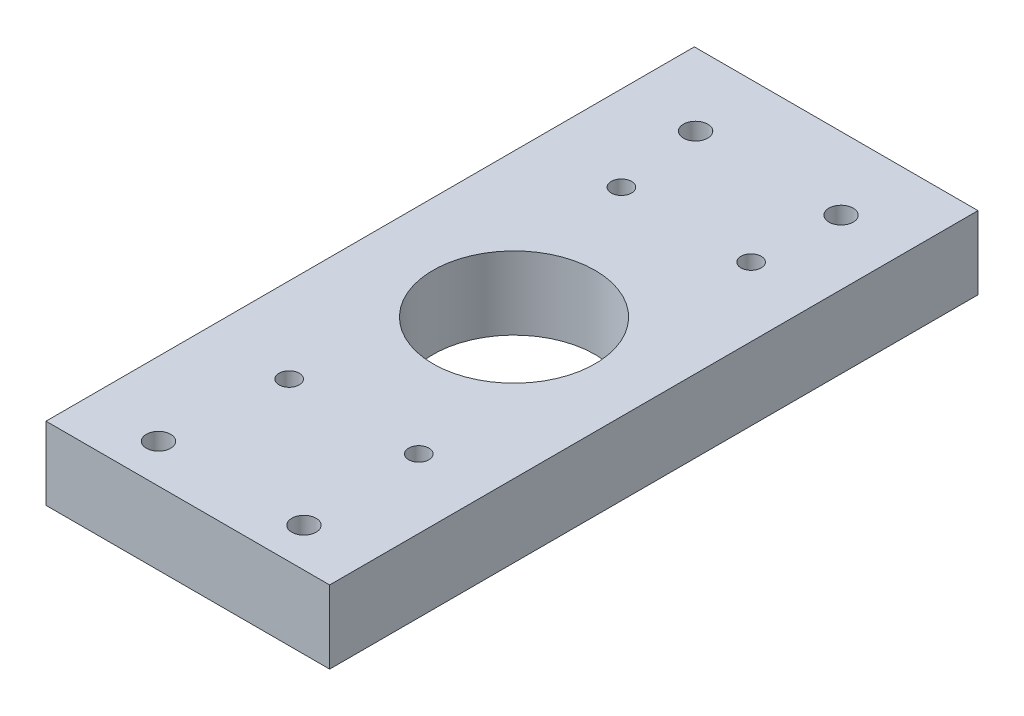
ISO-10303-21;
HEADER;
FILE_DESCRIPTION(('STEP AP214'),'2;1');
FILE_NAME('part.step','',(''),(''),'','','');
FILE_SCHEMA(('AUTOMOTIVE_DESIGN { 1 0 10303 214 1 1 1 1 }'));
ENDSEC;
DATA;
#1=APPLICATION_CONTEXT('core data for automotive mechanical design processes');
#2=APPLICATION_PROTOCOL_DEFINITION('international standard','automotive_design',2000,#1);
#3=PRODUCT_CONTEXT('',#1,'mechanical');
#4=PRODUCT('Part','Part','',(#3));
#5=PRODUCT_RELATED_PRODUCT_CATEGORY('part','',(#4));
#6=PRODUCT_DEFINITION_FORMATION('','',#4);
#7=PRODUCT_DEFINITION_CONTEXT('part definition',#1,'design');
#8=PRODUCT_DEFINITION('design','',#6,#7);
#9=PRODUCT_DEFINITION_SHAPE('','',#8);
#10=(LENGTH_UNIT() NAMED_UNIT(*) SI_UNIT(.MILLI.,.METRE.));
#11=(NAMED_UNIT(*) PLANE_ANGLE_UNIT() SI_UNIT($,.RADIAN.));
#12=(NAMED_UNIT(*) SI_UNIT($,.STERADIAN.) SOLID_ANGLE_UNIT());
#13=UNCERTAINTY_MEASURE_WITH_UNIT(LENGTH_MEASURE(1.E-05),#10,'distance_accuracy_value','');
#14=(GEOMETRIC_REPRESENTATION_CONTEXT(3) GLOBAL_UNCERTAINTY_ASSIGNED_CONTEXT((#13)) GLOBAL_UNIT_ASSIGNED_CONTEXT((#10,
#11,#12)) REPRESENTATION_CONTEXT('',''));
#15=CARTESIAN_POINT('',(0.,0.,0.));
#16=DIRECTION('',(0.,0.,1.));
#17=DIRECTION('',(1.,0.,0.));
#18=AXIS2_PLACEMENT_3D('',#15,#16,#17);
#19=CARTESIAN_POINT('',(35.,18.,-80.));
#20=DIRECTION('',(-1.,0.,0.));
#21=DIRECTION('',(0.,0.,1.));
#22=AXIS2_PLACEMENT_3D('',#19,#20,#21);
#23=PLANE('',#22);
#24=DIRECTION('',(0.,0.,-1.));
#25=VECTOR('',#24,1.);
#26=CARTESIAN_POINT('',(35.,0.,-80.));
#27=LINE('',#26,#25);
#28=CARTESIAN_POINT('',(35.,0.,80.));
#29=VERTEX_POINT('',#28);
#30=CARTESIAN_POINT('',(35.,0.,-80.));
#31=VERTEX_POINT('',#30);
#32=EDGE_CURVE('E96',#29,#31,#27,.T.);
#33=ORIENTED_EDGE('',*,*,#32,.T.);
#34=DIRECTION('',(0.,-1.,0.));
#35=VECTOR('',#34,1.);
#36=CARTESIAN_POINT('',(35.,18.,-80.));
#37=LINE('',#36,#35);
#38=CARTESIAN_POINT('',(35.,18.,-80.));
#39=VERTEX_POINT('',#38);
#40=EDGE_CURVE('E11',#39,#31,#37,.T.);
#41=ORIENTED_EDGE('',*,*,#40,.F.);
#42=DIRECTION('',(0.,0.,-1.));
#43=VECTOR('',#42,1.);
#44=CARTESIAN_POINT('',(35.,18.,-80.));
#45=LINE('',#44,#43);
#46=CARTESIAN_POINT('',(35.,18.,80.));
#47=VERTEX_POINT('',#46);
#48=EDGE_CURVE('E84',#47,#39,#45,.T.);
#49=ORIENTED_EDGE('',*,*,#48,.F.);
#50=DIRECTION('',(0.,-1.,0.));
#51=VECTOR('',#50,1.);
#52=CARTESIAN_POINT('',(35.,18.,80.));
#53=LINE('',#52,#51);
#54=EDGE_CURVE('E92',#47,#29,#53,.T.);
#55=ORIENTED_EDGE('',*,*,#54,.T.);
#56=EDGE_LOOP('',(#33,#41,#49,#55));
#57=FACE_BOUND('',#56,.T.);
#58=ADVANCED_FACE('F33',(#57),#23,.F.);
#59=CARTESIAN_POINT('',(-35.,18.,-80.));
#60=DIRECTION('',(0.,0.,1.));
#61=DIRECTION('',(1.,0.,0.));
#62=AXIS2_PLACEMENT_3D('',#59,#60,#61);
#63=PLANE('',#62);
#64=DIRECTION('',(-1.,0.,0.));
#65=VECTOR('',#64,1.);
#66=CARTESIAN_POINT('',(-35.,0.,-80.));
#67=LINE('',#66,#65);
#68=CARTESIAN_POINT('',(-35.,0.,-80.));
#69=VERTEX_POINT('',#68);
#70=EDGE_CURVE('E88',#31,#69,#67,.T.);
#71=ORIENTED_EDGE('',*,*,#70,.T.);
#72=DIRECTION('',(0.,-1.,0.));
#73=VECTOR('',#72,1.);
#74=CARTESIAN_POINT('',(-35.,18.,-80.));
#75=LINE('',#74,#73);
#76=CARTESIAN_POINT('',(-35.,18.,-80.));
#77=VERTEX_POINT('',#76);
#78=EDGE_CURVE('E41',#77,#69,#75,.T.);
#79=ORIENTED_EDGE('',*,*,#78,.F.);
#80=DIRECTION('',(-1.,0.,0.));
#81=VECTOR('',#80,1.);
#82=CARTESIAN_POINT('',(-35.,18.,-80.));
#83=LINE('',#82,#81);
#84=EDGE_CURVE('E79',#39,#77,#83,.T.);
#85=ORIENTED_EDGE('',*,*,#84,.F.);
#86=ORIENTED_EDGE('',*,*,#40,.T.);
#87=EDGE_LOOP('',(#71,#79,#85,#86));
#88=FACE_BOUND('',#87,.T.);
#89=ADVANCED_FACE('F87',(#88),#63,.F.);
#90=CARTESIAN_POINT('',(-35.,18.,-80.));
#91=DIRECTION('',(1.,0.,0.));
#92=DIRECTION('',(0.,0.,-1.));
#93=AXIS2_PLACEMENT_3D('',#90,#91,#92);
#94=PLANE('',#93);
#95=CARTESIAN_POINT('',(-35.,9.,28.));
#96=DIRECTION('',(-1.,0.,0.));
#97=DIRECTION('',(0.,0.,1.));
#98=AXIS2_PLACEMENT_3D('',#95,#96,#97);
#99=CIRCLE('',#98,2.);
#100=CARTESIAN_POINT('',(-35.,9.,30.));
#101=VERTEX_POINT('',#100);
#102=EDGE_CURVE('E148',#101,#101,#99,.T.);
#103=ORIENTED_EDGE('',*,*,#102,.F.);
#104=EDGE_LOOP('',(#103));
#105=FACE_BOUND('',#104,.T.);
#106=CARTESIAN_POINT('',(-35.,9.,-28.));
#107=DIRECTION('',(-1.,0.,0.));
#108=DIRECTION('',(0.,0.,1.));
#109=AXIS2_PLACEMENT_3D('',#106,#107,#108);
#110=CIRCLE('',#109,2.);
#111=CARTESIAN_POINT('',(-35.,9.,-26.));
#112=VERTEX_POINT('',#111);
#113=EDGE_CURVE('E142',#112,#112,#110,.T.);
#114=ORIENTED_EDGE('',*,*,#113,.F.);
#115=EDGE_LOOP('',(#114));
#116=FACE_BOUND('',#115,.T.);
#117=DIRECTION('',(0.,0.,1.));
#118=VECTOR('',#117,1.);
#119=CARTESIAN_POINT('',(-35.,0.,-80.));
#120=LINE('',#119,#118);
#121=CARTESIAN_POINT('',(-35.,0.,80.));
#122=VERTEX_POINT('',#121);
#123=EDGE_CURVE('E66',#69,#122,#120,.T.);
#124=ORIENTED_EDGE('',*,*,#123,.T.);
#125=DIRECTION('',(0.,-1.,0.));
#126=VECTOR('',#125,1.);
#127=CARTESIAN_POINT('',(-35.,18.,80.));
#128=LINE('',#127,#126);
#129=CARTESIAN_POINT('',(-35.,18.,80.));
#130=VERTEX_POINT('',#129);
#131=EDGE_CURVE('E89',#130,#122,#128,.T.);
#132=ORIENTED_EDGE('',*,*,#131,.F.);
#133=DIRECTION('',(0.,0.,1.));
#134=VECTOR('',#133,1.);
#135=CARTESIAN_POINT('',(-35.,18.,-80.));
#136=LINE('',#135,#134);
#137=EDGE_CURVE('E82',#77,#130,#136,.T.);
#138=ORIENTED_EDGE('',*,*,#137,.F.);
#139=ORIENTED_EDGE('',*,*,#78,.T.);
#140=EDGE_LOOP('',(#124,#132,#138,#139));
#141=FACE_BOUND('',#140,.T.);
#142=ADVANCED_FACE('F90',(#105,#116,#141),#94,.F.);
#143=CARTESIAN_POINT('',(-35.,18.,80.));
#144=DIRECTION('',(0.,0.,-1.));
#145=DIRECTION('',(-1.,0.,0.));
#146=AXIS2_PLACEMENT_3D('',#143,#144,#145);
#147=PLANE('',#146);
#148=DIRECTION('',(1.,0.,0.));
#149=VECTOR('',#148,1.);
#150=CARTESIAN_POINT('',(-35.,0.,80.));
#151=LINE('',#150,#149);
#152=EDGE_CURVE('E72',#122,#29,#151,.T.);
#153=ORIENTED_EDGE('',*,*,#152,.T.);
#154=ORIENTED_EDGE('',*,*,#54,.F.);
#155=DIRECTION('',(1.,0.,0.));
#156=VECTOR('',#155,1.);
#157=CARTESIAN_POINT('',(-35.,18.,80.));
#158=LINE('',#157,#156);
#159=EDGE_CURVE('E49',#130,#47,#158,.T.);
#160=ORIENTED_EDGE('',*,*,#159,.F.);
#161=ORIENTED_EDGE('',*,*,#131,.T.);
#162=EDGE_LOOP('',(#153,#154,#160,#161));
#163=FACE_BOUND('',#162,.T.);
#164=ADVANCED_FACE('F104',(#163),#147,.F.);
#165=CARTESIAN_POINT('',(0.,18.,0.));
#166=DIRECTION('',(0.,1.,0.));
#167=DIRECTION('',(0.,0.,1.));
#168=AXIS2_PLACEMENT_3D('',#165,#166,#167);
#169=PLANE('',#168);
#170=CARTESIAN_POINT('',(18.,18.,-41.));
#171=DIRECTION('',(0.,1.,0.));
#172=DIRECTION('',(0.,0.,1.));
#173=AXIS2_PLACEMENT_3D('',#170,#171,#172);
#174=CIRCLE('',#173,2.49999999999999);
#175=CARTESIAN_POINT('',(18.,18.,-38.5));
#176=VERTEX_POINT('',#175);
#177=EDGE_CURVE('E172',#176,#176,#174,.T.);
#178=ORIENTED_EDGE('',*,*,#177,.F.);
#179=EDGE_LOOP('',(#178));
#180=FACE_BOUND('',#179,.T.);
#181=CARTESIAN_POINT('',(-14.,18.,-41.));
#182=DIRECTION('',(0.,1.,0.));
#183=DIRECTION('',(0.,0.,1.));
#184=AXIS2_PLACEMENT_3D('',#181,#182,#183);
#185=CIRCLE('',#184,2.49999999999999);
#186=CARTESIAN_POINT('',(-14.,18.,-38.5));
#187=VERTEX_POINT('',#186);
#188=EDGE_CURVE('E166',#187,#187,#185,.T.);
#189=ORIENTED_EDGE('',*,*,#188,.F.);
#190=EDGE_LOOP('',(#189));
#191=FACE_BOUND('',#190,.T.);
#192=CARTESIAN_POINT('',(18.,18.,41.));
#193=DIRECTION('',(0.,1.,0.));
#194=DIRECTION('',(0.,0.,1.));
#195=AXIS2_PLACEMENT_3D('',#192,#193,#194);
#196=CIRCLE('',#195,2.49999999999999);
#197=CARTESIAN_POINT('',(18.,18.,43.5));
#198=VERTEX_POINT('',#197);
#199=EDGE_CURVE('E160',#198,#198,#196,.T.);
#200=ORIENTED_EDGE('',*,*,#199,.F.);
#201=EDGE_LOOP('',(#200));
#202=FACE_BOUND('',#201,.T.);
#203=CARTESIAN_POINT('',(-14.,18.,41.));
#204=DIRECTION('',(0.,1.,0.));
#205=DIRECTION('',(0.,0.,1.));
#206=AXIS2_PLACEMENT_3D('',#203,#204,#205);
#207=CIRCLE('',#206,2.49999999999999);
#208=CARTESIAN_POINT('',(-14.,18.,43.5));
#209=VERTEX_POINT('',#208);
#210=EDGE_CURVE('E154',#209,#209,#207,.T.);
#211=ORIENTED_EDGE('',*,*,#210,.F.);
#212=EDGE_LOOP('',(#211));
#213=FACE_BOUND('',#212,.T.);
#214=CARTESIAN_POINT('',(19.0690961260032,18.,-62.135567862228));
#215=DIRECTION('',(0.,1.,0.));
#216=DIRECTION('',(0.,0.,1.));
#217=AXIS2_PLACEMENT_3D('',#214,#215,#216);
#218=CIRCLE('',#217,3.);
#219=CARTESIAN_POINT('',(19.0690961260032,18.,-59.135567862228));
#220=VERTEX_POINT('',#219);
#221=EDGE_CURVE('E136',#220,#220,#218,.T.);
#222=ORIENTED_EDGE('',*,*,#221,.F.);
#223=EDGE_LOOP('',(#222));
#224=FACE_BOUND('',#223,.T.);
#225=CARTESIAN_POINT('',(-16.8245689178548,18.,-62.135567862228));
#226=DIRECTION('',(0.,1.,0.));
#227=DIRECTION('',(0.,0.,1.));
#228=AXIS2_PLACEMENT_3D('',#225,#226,#227);
#229=CIRCLE('',#228,3.);
#230=CARTESIAN_POINT('',(-16.8245689178548,18.,-59.135567862228));
#231=VERTEX_POINT('',#230);
#232=EDGE_CURVE('E130',#231,#231,#229,.T.);
#233=ORIENTED_EDGE('',*,*,#232,.F.);
#234=EDGE_LOOP('',(#233));
#235=FACE_BOUND('',#234,.T.);
#236=CARTESIAN_POINT('',(19.0690961260032,18.,70.4129628570342));
#237=DIRECTION('',(0.,1.,0.));
#238=DIRECTION('',(0.,0.,1.));
#239=AXIS2_PLACEMENT_3D('',#236,#237,#238);
#240=CIRCLE('',#239,3.);
#241=CARTESIAN_POINT('',(19.0690961260032,18.,73.4129628570342));
#242=VERTEX_POINT('',#241);
#243=EDGE_CURVE('E124',#242,#242,#240,.T.);
#244=ORIENTED_EDGE('',*,*,#243,.F.);
#245=EDGE_LOOP('',(#244));
#246=FACE_BOUND('',#245,.T.);
#247=CARTESIAN_POINT('',(-16.8245689178548,18.,70.4129628570342));
#248=DIRECTION('',(0.,1.,0.));
#249=DIRECTION('',(0.,0.,1.));
#250=AXIS2_PLACEMENT_3D('',#247,#248,#249);
#251=CIRCLE('',#250,3.);
#252=CARTESIAN_POINT('',(-16.8245689178548,18.,73.4129628570342));
#253=VERTEX_POINT('',#252);
#254=EDGE_CURVE('E118',#253,#253,#251,.T.);
#255=ORIENTED_EDGE('',*,*,#254,.F.);
#256=EDGE_LOOP('',(#255));
#257=FACE_BOUND('',#256,.T.);
#258=CARTESIAN_POINT('',(0.500000036068416,18.,-0.00184131193188206));
#259=DIRECTION('',(0.,1.,0.));
#260=DIRECTION('',(0.,0.,1.));
#261=AXIS2_PLACEMENT_3D('',#258,#259,#260);
#262=CIRCLE('',#261,20.);
#263=CARTESIAN_POINT('',(0.500000036068416,18.,19.9981586880681));
#264=VERTEX_POINT('',#263);
#265=EDGE_CURVE('E110',#264,#264,#262,.T.);
#266=ORIENTED_EDGE('',*,*,#265,.F.);
#267=EDGE_LOOP('',(#266));
#268=FACE_BOUND('',#267,.T.);
#269=ORIENTED_EDGE('',*,*,#48,.T.);
#270=ORIENTED_EDGE('',*,*,#84,.T.);
#271=ORIENTED_EDGE('',*,*,#137,.T.);
#272=ORIENTED_EDGE('',*,*,#159,.T.);
#273=EDGE_LOOP('',(#269,#270,#271,#272));
#274=FACE_BOUND('',#273,.T.);
#275=ADVANCED_FACE('F80',(#180,#191,#202,#213,#224,#235,#246,#257,#268,#274),#169,.T.);
#276=CARTESIAN_POINT('',(0.,0.,0.));
#277=DIRECTION('',(0.,1.,0.));
#278=DIRECTION('',(0.,0.,1.));
#279=AXIS2_PLACEMENT_3D('',#276,#277,#278);
#280=PLANE('',#279);
#281=CARTESIAN_POINT('',(18.,0.,-41.));
#282=DIRECTION('',(0.,1.,0.));
#283=DIRECTION('',(0.,0.,1.));
#284=AXIS2_PLACEMENT_3D('',#281,#282,#283);
#285=CIRCLE('',#284,2.49999999999999);
#286=CARTESIAN_POINT('',(18.,0.,-38.5));
#287=VERTEX_POINT('',#286);
#288=EDGE_CURVE('E169',#287,#287,#285,.T.);
#289=ORIENTED_EDGE('',*,*,#288,.T.);
#290=EDGE_LOOP('',(#289));
#291=FACE_BOUND('',#290,.T.);
#292=CARTESIAN_POINT('',(-14.,0.,-41.));
#293=DIRECTION('',(0.,1.,0.));
#294=DIRECTION('',(0.,0.,1.));
#295=AXIS2_PLACEMENT_3D('',#292,#293,#294);
#296=CIRCLE('',#295,2.49999999999999);
#297=CARTESIAN_POINT('',(-14.,0.,-38.5));
#298=VERTEX_POINT('',#297);
#299=EDGE_CURVE('E163',#298,#298,#296,.T.);
#300=ORIENTED_EDGE('',*,*,#299,.T.);
#301=EDGE_LOOP('',(#300));
#302=FACE_BOUND('',#301,.T.);
#303=CARTESIAN_POINT('',(18.,0.,41.));
#304=DIRECTION('',(0.,1.,0.));
#305=DIRECTION('',(0.,0.,1.));
#306=AXIS2_PLACEMENT_3D('',#303,#304,#305);
#307=CIRCLE('',#306,2.49999999999999);
#308=CARTESIAN_POINT('',(18.,0.,43.5));
#309=VERTEX_POINT('',#308);
#310=EDGE_CURVE('E157',#309,#309,#307,.T.);
#311=ORIENTED_EDGE('',*,*,#310,.T.);
#312=EDGE_LOOP('',(#311));
#313=FACE_BOUND('',#312,.T.);
#314=CARTESIAN_POINT('',(-14.,0.,41.));
#315=DIRECTION('',(0.,1.,0.));
#316=DIRECTION('',(0.,0.,1.));
#317=AXIS2_PLACEMENT_3D('',#314,#315,#316);
#318=CIRCLE('',#317,2.49999999999999);
#319=CARTESIAN_POINT('',(-14.,0.,43.5));
#320=VERTEX_POINT('',#319);
#321=EDGE_CURVE('E151',#320,#320,#318,.T.);
#322=ORIENTED_EDGE('',*,*,#321,.T.);
#323=EDGE_LOOP('',(#322));
#324=FACE_BOUND('',#323,.T.);
#325=CARTESIAN_POINT('',(19.0690961260032,0.,-62.135567862228));
#326=DIRECTION('',(0.,1.,0.));
#327=DIRECTION('',(0.,0.,1.));
#328=AXIS2_PLACEMENT_3D('',#325,#326,#327);
#329=CIRCLE('',#328,3.);
#330=CARTESIAN_POINT('',(19.0690961260032,0.,-59.135567862228));
#331=VERTEX_POINT('',#330);
#332=EDGE_CURVE('E133',#331,#331,#329,.T.);
#333=ORIENTED_EDGE('',*,*,#332,.T.);
#334=EDGE_LOOP('',(#333));
#335=FACE_BOUND('',#334,.T.);
#336=CARTESIAN_POINT('',(-16.8245689178548,0.,-62.135567862228));
#337=DIRECTION('',(0.,1.,0.));
#338=DIRECTION('',(0.,0.,1.));
#339=AXIS2_PLACEMENT_3D('',#336,#337,#338);
#340=CIRCLE('',#339,3.);
#341=CARTESIAN_POINT('',(-16.8245689178548,0.,-59.135567862228));
#342=VERTEX_POINT('',#341);
#343=EDGE_CURVE('E127',#342,#342,#340,.T.);
#344=ORIENTED_EDGE('',*,*,#343,.T.);
#345=EDGE_LOOP('',(#344));
#346=FACE_BOUND('',#345,.T.);
#347=CARTESIAN_POINT('',(19.0690961260032,0.,70.4129628570342));
#348=DIRECTION('',(0.,1.,0.));
#349=DIRECTION('',(0.,0.,1.));
#350=AXIS2_PLACEMENT_3D('',#347,#348,#349);
#351=CIRCLE('',#350,3.);
#352=CARTESIAN_POINT('',(19.0690961260032,0.,73.4129628570342));
#353=VERTEX_POINT('',#352);
#354=EDGE_CURVE('E121',#353,#353,#351,.T.);
#355=ORIENTED_EDGE('',*,*,#354,.T.);
#356=EDGE_LOOP('',(#355));
#357=FACE_BOUND('',#356,.T.);
#358=CARTESIAN_POINT('',(-16.8245689178548,0.,70.4129628570342));
#359=DIRECTION('',(0.,1.,0.));
#360=DIRECTION('',(0.,0.,1.));
#361=AXIS2_PLACEMENT_3D('',#358,#359,#360);
#362=CIRCLE('',#361,3.);
#363=CARTESIAN_POINT('',(-16.8245689178548,0.,73.4129628570342));
#364=VERTEX_POINT('',#363);
#365=EDGE_CURVE('E113',#364,#364,#362,.T.);
#366=ORIENTED_EDGE('',*,*,#365,.T.);
#367=EDGE_LOOP('',(#366));
#368=FACE_BOUND('',#367,.T.);
#369=CARTESIAN_POINT('',(0.500000036068416,0.,-0.00184131193188206));
#370=DIRECTION('',(0.,1.,0.));
#371=DIRECTION('',(0.,0.,1.));
#372=AXIS2_PLACEMENT_3D('',#369,#370,#371);
#373=CIRCLE('',#372,20.);
#374=CARTESIAN_POINT('',(0.500000036068416,0.,19.9981586880681));
#375=VERTEX_POINT('',#374);
#376=EDGE_CURVE('E99',#375,#375,#373,.T.);
#377=ORIENTED_EDGE('',*,*,#376,.T.);
#378=EDGE_LOOP('',(#377));
#379=FACE_BOUND('',#378,.T.);
#380=ORIENTED_EDGE('',*,*,#32,.F.);
#381=ORIENTED_EDGE('',*,*,#152,.F.);
#382=ORIENTED_EDGE('',*,*,#123,.F.);
#383=ORIENTED_EDGE('',*,*,#70,.F.);
#384=EDGE_LOOP('',(#380,#381,#382,#383));
#385=FACE_BOUND('',#384,.T.);
#386=ADVANCED_FACE('F107',(#291,#302,#313,#324,#335,#346,#357,#368,#379,#385),#280,.F.);
#387=CARTESIAN_POINT('',(0.500000036068416,0.,-0.00184131193188206));
#388=DIRECTION('',(0.,1.,0.));
#389=DIRECTION('',(0.,0.,1.));
#390=AXIS2_PLACEMENT_3D('',#387,#388,#389);
#391=CYLINDRICAL_SURFACE('',#390,20.);
#392=ORIENTED_EDGE('',*,*,#376,.F.);
#393=EDGE_LOOP('',(#392));
#394=FACE_BOUND('',#393,.T.);
#395=ORIENTED_EDGE('',*,*,#265,.T.);
#396=EDGE_LOOP('',(#395));
#397=FACE_BOUND('',#396,.T.);
#398=ADVANCED_FACE('F197',(#394,#397),#391,.F.);
#399=CARTESIAN_POINT('',(-16.8245689178548,18.,70.4129628570342));
#400=DIRECTION('',(0.,1.,0.));
#401=DIRECTION('',(0.,0.,1.));
#402=AXIS2_PLACEMENT_3D('',#399,#400,#401);
#403=CYLINDRICAL_SURFACE('',#402,3.);
#404=ORIENTED_EDGE('',*,*,#365,.F.);
#405=EDGE_LOOP('',(#404));
#406=FACE_BOUND('',#405,.T.);
#407=ORIENTED_EDGE('',*,*,#254,.T.);
#408=EDGE_LOOP('',(#407));
#409=FACE_BOUND('',#408,.T.);
#410=ADVANCED_FACE('F199',(#406,#409),#403,.F.);
#411=CARTESIAN_POINT('',(19.0690961260032,18.,70.4129628570342));
#412=DIRECTION('',(0.,1.,0.));
#413=DIRECTION('',(0.,0.,1.));
#414=AXIS2_PLACEMENT_3D('',#411,#412,#413);
#415=CYLINDRICAL_SURFACE('',#414,3.);
#416=ORIENTED_EDGE('',*,*,#354,.F.);
#417=EDGE_LOOP('',(#416));
#418=FACE_BOUND('',#417,.T.);
#419=ORIENTED_EDGE('',*,*,#243,.T.);
#420=EDGE_LOOP('',(#419));
#421=FACE_BOUND('',#420,.T.);
#422=ADVANCED_FACE('F206',(#418,#421),#415,.F.);
#423=CARTESIAN_POINT('',(-16.8245689178548,18.,-62.135567862228));
#424=DIRECTION('',(0.,1.,0.));
#425=DIRECTION('',(0.,0.,1.));
#426=AXIS2_PLACEMENT_3D('',#423,#424,#425);
#427=CYLINDRICAL_SURFACE('',#426,3.);
#428=ORIENTED_EDGE('',*,*,#343,.F.);
#429=EDGE_LOOP('',(#428));
#430=FACE_BOUND('',#429,.T.);
#431=ORIENTED_EDGE('',*,*,#232,.T.);
#432=EDGE_LOOP('',(#431));
#433=FACE_BOUND('',#432,.T.);
#434=ADVANCED_FACE('F302',(#430,#433),#427,.F.);
#435=CARTESIAN_POINT('',(19.0690961260032,18.,-62.135567862228));
#436=DIRECTION('',(0.,1.,0.));
#437=DIRECTION('',(0.,0.,1.));
#438=AXIS2_PLACEMENT_3D('',#435,#436,#437);
#439=CYLINDRICAL_SURFACE('',#438,3.);
#440=ORIENTED_EDGE('',*,*,#332,.F.);
#441=EDGE_LOOP('',(#440));
#442=FACE_BOUND('',#441,.T.);
#443=ORIENTED_EDGE('',*,*,#221,.T.);
#444=EDGE_LOOP('',(#443));
#445=FACE_BOUND('',#444,.T.);
#446=ADVANCED_FACE('F298',(#442,#445),#439,.F.);
#447=CARTESIAN_POINT('',(-5.,8.99999999999999,-28.));
#448=DIRECTION('',(1.,0.,0.));
#449=DIRECTION('',(0.,0.,-1.));
#450=AXIS2_PLACEMENT_3D('',#447,#448,#449);
#451=PLANE('',#450);
#452=CARTESIAN_POINT('',(-5.,9.,-28.));
#453=DIRECTION('',(-1.,0.,0.));
#454=DIRECTION('',(0.,0.,1.));
#455=AXIS2_PLACEMENT_3D('',#452,#453,#454);
#456=CIRCLE('',#455,1.99999999999999);
#457=CARTESIAN_POINT('',(-5.,9.,-26.));
#458=VERTEX_POINT('',#457);
#459=EDGE_CURVE('E139',#458,#458,#456,.T.);
#460=ORIENTED_EDGE('',*,*,#459,.T.);
#461=EDGE_LOOP('',(#460));
#462=FACE_BOUND('',#461,.T.);
#463=ADVANCED_FACE('F294',(#462),#451,.F.);
#464=CARTESIAN_POINT('',(-35.,9.,-28.));
#465=DIRECTION('',(-1.,0.,0.));
#466=DIRECTION('',(0.,0.,1.));
#467=AXIS2_PLACEMENT_3D('',#464,#465,#466);
#468=CYLINDRICAL_SURFACE('',#467,1.99999999999999);
#469=ORIENTED_EDGE('',*,*,#459,.F.);
#470=EDGE_LOOP('',(#469));
#471=FACE_BOUND('',#470,.T.);
#472=ORIENTED_EDGE('',*,*,#113,.T.);
#473=EDGE_LOOP('',(#472));
#474=FACE_BOUND('',#473,.T.);
#475=ADVANCED_FACE('F290',(#471,#474),#468,.F.);
#476=CARTESIAN_POINT('',(-5.,8.99999999999999,28.));
#477=DIRECTION('',(1.,0.,0.));
#478=DIRECTION('',(0.,0.,-1.));
#479=AXIS2_PLACEMENT_3D('',#476,#477,#478);
#480=PLANE('',#479);
#481=CARTESIAN_POINT('',(-5.,9.,28.));
#482=DIRECTION('',(-1.,0.,0.));
#483=DIRECTION('',(0.,0.,1.));
#484=AXIS2_PLACEMENT_3D('',#481,#482,#483);
#485=CIRCLE('',#484,1.99999999999999);
#486=CARTESIAN_POINT('',(-5.,9.,30.));
#487=VERTEX_POINT('',#486);
#488=EDGE_CURVE('E145',#487,#487,#485,.T.);
#489=ORIENTED_EDGE('',*,*,#488,.T.);
#490=EDGE_LOOP('',(#489));
#491=FACE_BOUND('',#490,.T.);
#492=ADVANCED_FACE('F286',(#491),#480,.F.);
#493=CARTESIAN_POINT('',(-35.,9.,28.));
#494=DIRECTION('',(-1.,0.,0.));
#495=DIRECTION('',(0.,0.,1.));
#496=AXIS2_PLACEMENT_3D('',#493,#494,#495);
#497=CYLINDRICAL_SURFACE('',#496,1.99999999999999);
#498=ORIENTED_EDGE('',*,*,#488,.F.);
#499=EDGE_LOOP('',(#498));
#500=FACE_BOUND('',#499,.T.);
#501=ORIENTED_EDGE('',*,*,#102,.T.);
#502=EDGE_LOOP('',(#501));
#503=FACE_BOUND('',#502,.T.);
#504=ADVANCED_FACE('F248',(#500,#503),#497,.F.);
#505=CARTESIAN_POINT('',(-14.,18.,41.));
#506=DIRECTION('',(0.,1.,0.));
#507=DIRECTION('',(0.,0.,1.));
#508=AXIS2_PLACEMENT_3D('',#505,#506,#507);
#509=CYLINDRICAL_SURFACE('',#508,2.49999999999999);
#510=ORIENTED_EDGE('',*,*,#321,.F.);
#511=EDGE_LOOP('',(#510));
#512=FACE_BOUND('',#511,.T.);
#513=ORIENTED_EDGE('',*,*,#210,.T.);
#514=EDGE_LOOP('',(#513));
#515=FACE_BOUND('',#514,.T.);
#516=ADVANCED_FACE('F242',(#512,#515),#509,.F.);
#517=CARTESIAN_POINT('',(18.,18.,41.));
#518=DIRECTION('',(0.,1.,0.));
#519=DIRECTION('',(0.,0.,1.));
#520=AXIS2_PLACEMENT_3D('',#517,#518,#519);
#521=CYLINDRICAL_SURFACE('',#520,2.49999999999999);
#522=ORIENTED_EDGE('',*,*,#310,.F.);
#523=EDGE_LOOP('',(#522));
#524=FACE_BOUND('',#523,.T.);
#525=ORIENTED_EDGE('',*,*,#199,.T.);
#526=EDGE_LOOP('',(#525));
#527=FACE_BOUND('',#526,.T.);
#528=ADVANCED_FACE('F247',(#524,#527),#521,.F.);
#529=CARTESIAN_POINT('',(-14.,18.,-41.));
#530=DIRECTION('',(0.,1.,0.));
#531=DIRECTION('',(0.,0.,1.));
#532=AXIS2_PLACEMENT_3D('',#529,#530,#531);
#533=CYLINDRICAL_SURFACE('',#532,2.49999999999999);
#534=ORIENTED_EDGE('',*,*,#299,.F.);
#535=EDGE_LOOP('',(#534));
#536=FACE_BOUND('',#535,.T.);
#537=ORIENTED_EDGE('',*,*,#188,.T.);
#538=EDGE_LOOP('',(#537));
#539=FACE_BOUND('',#538,.T.);
#540=ADVANCED_FACE('F260',(#536,#539),#533,.F.);
#541=CARTESIAN_POINT('',(18.,18.,-41.));
#542=DIRECTION('',(0.,1.,0.));
#543=DIRECTION('',(0.,0.,1.));
#544=AXIS2_PLACEMENT_3D('',#541,#542,#543);
#545=CYLINDRICAL_SURFACE('',#544,2.49999999999999);
#546=ORIENTED_EDGE('',*,*,#288,.F.);
#547=EDGE_LOOP('',(#546));
#548=FACE_BOUND('',#547,.T.);
#549=ORIENTED_EDGE('',*,*,#177,.T.);
#550=EDGE_LOOP('',(#549));
#551=FACE_BOUND('',#550,.T.);
#552=ADVANCED_FACE('F176',(#548,#551),#545,.F.);
#553=CLOSED_SHELL('',(#58,#89,#142,#164,#275,#386,#398,#410,#422,#434,#446,#463,#475,#492,#504,
#516,#528,#540,#552));
#554=MANIFOLD_SOLID_BREP('B2',#553);
#555=ADVANCED_BREP_SHAPE_REPRESENTATION('',(#18,#554),#14);
#556=SHAPE_DEFINITION_REPRESENTATION(#9,#555);
ENDSEC;
END-ISO-10303-21;
